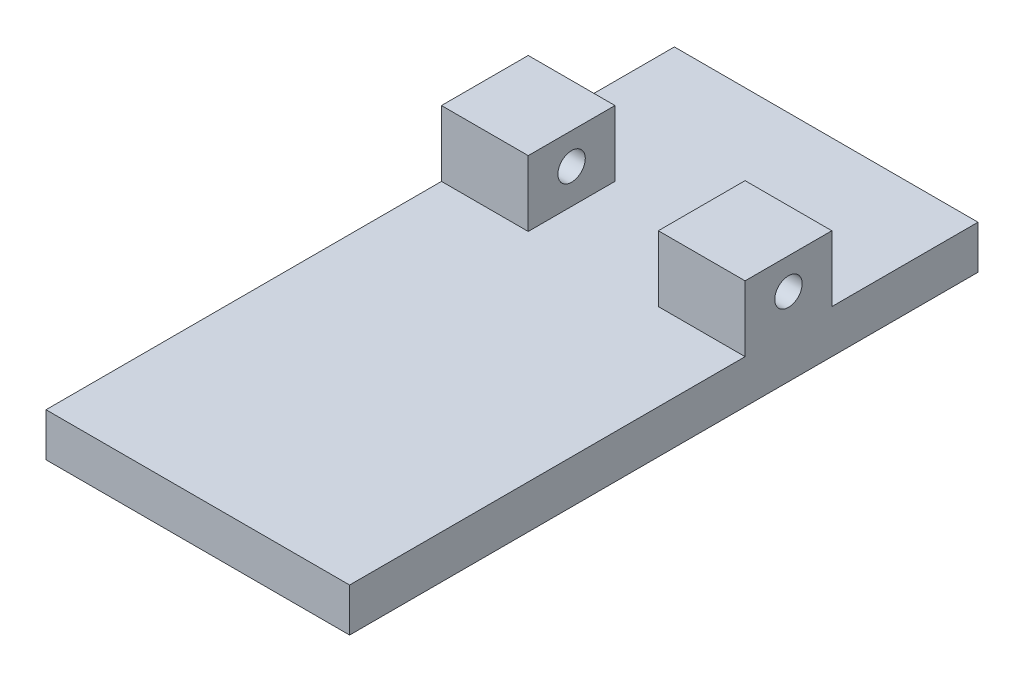
ISO-10303-21;
HEADER;
FILE_DESCRIPTION(('STEP AP214'),'2;1');
FILE_NAME('part.step','',(''),(''),'','','');
FILE_SCHEMA(('AUTOMOTIVE_DESIGN { 1 0 10303 214 1 1 1 1 }'));
ENDSEC;
DATA;
#1=APPLICATION_CONTEXT('core data for automotive mechanical design processes');
#2=APPLICATION_PROTOCOL_DEFINITION('international standard','automotive_design',2000,#1);
#3=PRODUCT_CONTEXT('',#1,'mechanical');
#4=PRODUCT('Part','Part','',(#3));
#5=PRODUCT_RELATED_PRODUCT_CATEGORY('part','',(#4));
#6=PRODUCT_DEFINITION_FORMATION('','',#4);
#7=PRODUCT_DEFINITION_CONTEXT('part definition',#1,'design');
#8=PRODUCT_DEFINITION('design','',#6,#7);
#9=PRODUCT_DEFINITION_SHAPE('','',#8);
#10=(LENGTH_UNIT() NAMED_UNIT(*) SI_UNIT(.MILLI.,.METRE.));
#11=(NAMED_UNIT(*) PLANE_ANGLE_UNIT() SI_UNIT($,.RADIAN.));
#12=(NAMED_UNIT(*) SI_UNIT($,.STERADIAN.) SOLID_ANGLE_UNIT());
#13=UNCERTAINTY_MEASURE_WITH_UNIT(LENGTH_MEASURE(1.E-05),#10,'distance_accuracy_value','');
#14=(GEOMETRIC_REPRESENTATION_CONTEXT(3) GLOBAL_UNCERTAINTY_ASSIGNED_CONTEXT((#13)) GLOBAL_UNIT_ASSIGNED_CONTEXT((#10,
#11,#12)) REPRESENTATION_CONTEXT('',''));
#15=CARTESIAN_POINT('',(0.,0.,0.));
#16=DIRECTION('',(0.,0.,1.));
#17=DIRECTION('',(1.,0.,0.));
#18=AXIS2_PLACEMENT_3D('',#15,#16,#17);
#19=CARTESIAN_POINT('',(-11.1125,3.175,20.6));
#20=DIRECTION('',(0.,0.,-1.));
#21=DIRECTION('',(-1.,0.,0.));
#22=AXIS2_PLACEMENT_3D('',#19,#20,#21);
#23=PLANE('',#22);
#24=DIRECTION('',(1.,0.,0.));
#25=VECTOR('',#24,1.);
#26=CARTESIAN_POINT('',(-11.1125,0.,20.6));
#27=LINE('',#26,#25);
#28=CARTESIAN_POINT('',(-11.1125,0.,20.6));
#29=VERTEX_POINT('',#28);
#30=CARTESIAN_POINT('',(11.1125,0.,20.6));
#31=VERTEX_POINT('',#30);
#32=EDGE_CURVE('E225',#29,#31,#27,.T.);
#33=ORIENTED_EDGE('',*,*,#32,.T.);
#34=DIRECTION('',(0.,-1.,0.));
#35=VECTOR('',#34,1.);
#36=CARTESIAN_POINT('',(11.1125,3.175,20.6));
#37=LINE('',#36,#35);
#38=CARTESIAN_POINT('',(11.1125,3.175,20.6));
#39=VERTEX_POINT('',#38);
#40=EDGE_CURVE('E11',#39,#31,#37,.T.);
#41=ORIENTED_EDGE('',*,*,#40,.F.);
#42=DIRECTION('',(1.,0.,0.));
#43=VECTOR('',#42,1.);
#44=CARTESIAN_POINT('',(-11.1125,3.175,20.6));
#45=LINE('',#44,#43);
#46=CARTESIAN_POINT('',(-11.1125,3.175,20.6));
#47=VERTEX_POINT('',#46);
#48=EDGE_CURVE('E226',#47,#39,#45,.T.);
#49=ORIENTED_EDGE('',*,*,#48,.F.);
#50=DIRECTION('',(0.,-1.,0.));
#51=VECTOR('',#50,1.);
#52=CARTESIAN_POINT('',(-11.1125,3.175,20.6));
#53=LINE('',#52,#51);
#54=EDGE_CURVE('E243',#47,#29,#53,.T.);
#55=ORIENTED_EDGE('',*,*,#54,.T.);
#56=EDGE_LOOP('',(#33,#41,#49,#55));
#57=FACE_BOUND('',#56,.T.);
#58=ADVANCED_FACE('F39',(#57),#23,.F.);
#59=CARTESIAN_POINT('',(11.1125,3.175,20.6));
#60=DIRECTION('',(-1.,0.,0.));
#61=DIRECTION('',(0.,0.,1.));
#62=AXIS2_PLACEMENT_3D('',#59,#60,#61);
#63=PLANE('',#62);
#64=CARTESIAN_POINT('',(11.1125,5.715,-11.525));
#65=DIRECTION('',(-1.,0.,0.));
#66=DIRECTION('',(0.,0.,1.));
#67=AXIS2_PLACEMENT_3D('',#64,#65,#66);
#68=CIRCLE('',#67,1.00249999999999);
#69=CARTESIAN_POINT('',(11.1125,5.715,-10.5225));
#70=VERTEX_POINT('',#69);
#71=EDGE_CURVE('E180',#70,#70,#68,.T.);
#72=ORIENTED_EDGE('',*,*,#71,.T.);
#73=EDGE_LOOP('',(#72));
#74=FACE_BOUND('',#73,.T.);
#75=DIRECTION('',(0.,0.,-1.));
#76=VECTOR('',#75,1.);
#77=CARTESIAN_POINT('',(11.1125,0.,20.6));
#78=LINE('',#77,#76);
#79=CARTESIAN_POINT('',(11.1125,0.,-25.4));
#80=VERTEX_POINT('',#79);
#81=EDGE_CURVE('E247',#31,#80,#78,.T.);
#82=ORIENTED_EDGE('',*,*,#81,.T.);
#83=DIRECTION('',(0.,-1.,0.));
#84=VECTOR('',#83,1.);
#85=CARTESIAN_POINT('',(11.1125,3.175,-25.4));
#86=LINE('',#85,#84);
#87=CARTESIAN_POINT('',(11.1125,3.175,-25.4));
#88=VERTEX_POINT('',#87);
#89=EDGE_CURVE('E47',#88,#80,#86,.T.);
#90=ORIENTED_EDGE('',*,*,#89,.F.);
#91=DIRECTION('',(0.,0.,-1.));
#92=VECTOR('',#91,1.);
#93=CARTESIAN_POINT('',(11.1125,3.175,20.6));
#94=LINE('',#93,#92);
#95=CARTESIAN_POINT('',(11.1125,3.175,-14.7));
#96=VERTEX_POINT('',#95);
#97=EDGE_CURVE('E230',#96,#88,#94,.T.);
#98=ORIENTED_EDGE('',*,*,#97,.F.);
#99=DIRECTION('',(0.,-1.,0.));
#100=VECTOR('',#99,1.);
#101=CARTESIAN_POINT('',(11.1125,7.98449,-14.7));
#102=LINE('',#101,#100);
#103=CARTESIAN_POINT('',(11.1125,7.98449,-14.7));
#104=VERTEX_POINT('',#103);
#105=EDGE_CURVE('E213',#104,#96,#102,.T.);
#106=ORIENTED_EDGE('',*,*,#105,.F.);
#107=DIRECTION('',(0.,0.,-1.));
#108=VECTOR('',#107,1.);
#109=CARTESIAN_POINT('',(11.1125,7.98449,-8.35));
#110=LINE('',#109,#108);
#111=CARTESIAN_POINT('',(11.1125,7.98449,-8.35));
#112=VERTEX_POINT('',#111);
#113=EDGE_CURVE('E193',#112,#104,#110,.T.);
#114=ORIENTED_EDGE('',*,*,#113,.F.);
#115=DIRECTION('',(0.,-1.,0.));
#116=VECTOR('',#115,1.);
#117=CARTESIAN_POINT('',(11.1125,7.98449,-8.35));
#118=LINE('',#117,#116);
#119=CARTESIAN_POINT('',(11.1125,3.175,-8.35));
#120=VERTEX_POINT('',#119);
#121=EDGE_CURVE('E217',#112,#120,#118,.T.);
#122=ORIENTED_EDGE('',*,*,#121,.T.);
#123=EDGE_CURVE('E232',#39,#120,#94,.T.);
#124=ORIENTED_EDGE('',*,*,#123,.F.);
#125=ORIENTED_EDGE('',*,*,#40,.T.);
#126=EDGE_LOOP('',(#82,#90,#98,#106,#114,#122,#124,#125));
#127=FACE_BOUND('',#126,.T.);
#128=ADVANCED_FACE('F270',(#74,#127),#63,.F.);
#129=CARTESIAN_POINT('',(-11.1125,3.175,-25.4));
#130=DIRECTION('',(0.,0.,-1.));
#131=DIRECTION('',(-1.,0.,0.));
#132=AXIS2_PLACEMENT_3D('',#129,#130,#131);
#133=PLANE('',#132);
#134=DIRECTION('',(1.,0.,0.));
#135=VECTOR('',#134,1.);
#136=CARTESIAN_POINT('',(-11.1125,0.,-25.4));
#137=LINE('',#136,#135);
#138=CARTESIAN_POINT('',(-11.1125,0.,-25.4));
#139=VERTEX_POINT('',#138);
#140=EDGE_CURVE('E251',#139,#80,#137,.T.);
#141=ORIENTED_EDGE('',*,*,#140,.F.);
#142=DIRECTION('',(0.,-1.,0.));
#143=VECTOR('',#142,1.);
#144=CARTESIAN_POINT('',(-11.1125,3.175,-25.4));
#145=LINE('',#144,#143);
#146=CARTESIAN_POINT('',(-11.1125,3.175,-25.4));
#147=VERTEX_POINT('',#146);
#148=EDGE_CURVE('E260',#147,#139,#145,.T.);
#149=ORIENTED_EDGE('',*,*,#148,.F.);
#150=DIRECTION('',(1.,0.,0.));
#151=VECTOR('',#150,1.);
#152=CARTESIAN_POINT('',(-11.1125,3.175,-25.4));
#153=LINE('',#152,#151);
#154=EDGE_CURVE('E235',#147,#88,#153,.T.);
#155=ORIENTED_EDGE('',*,*,#154,.T.);
#156=ORIENTED_EDGE('',*,*,#89,.T.);
#157=EDGE_LOOP('',(#141,#149,#155,#156));
#158=FACE_BOUND('',#157,.T.);
#159=ADVANCED_FACE('F266',(#158),#133,.T.);
#160=CARTESIAN_POINT('',(-11.1125,3.175,20.6));
#161=DIRECTION('',(-1.,0.,0.));
#162=DIRECTION('',(0.,0.,1.));
#163=AXIS2_PLACEMENT_3D('',#160,#161,#162);
#164=PLANE('',#163);
#165=CARTESIAN_POINT('',(-11.1125,5.715,-11.525));
#166=DIRECTION('',(1.,0.,0.));
#167=DIRECTION('',(0.,0.,-1.));
#168=AXIS2_PLACEMENT_3D('',#165,#166,#167);
#169=CIRCLE('',#168,1.00249999999999);
#170=CARTESIAN_POINT('',(-11.1125,5.715,-12.5275));
#171=VERTEX_POINT('',#170);
#172=EDGE_CURVE('E164',#171,#171,#169,.T.);
#173=ORIENTED_EDGE('',*,*,#172,.T.);
#174=EDGE_LOOP('',(#173));
#175=FACE_BOUND('',#174,.T.);
#176=DIRECTION('',(0.,0.,-1.));
#177=VECTOR('',#176,1.);
#178=CARTESIAN_POINT('',(-11.1125,0.,20.6));
#179=LINE('',#178,#177);
#180=EDGE_CURVE('E231',#29,#139,#179,.T.);
#181=ORIENTED_EDGE('',*,*,#180,.F.);
#182=ORIENTED_EDGE('',*,*,#54,.F.);
#183=DIRECTION('',(0.,0.,-1.));
#184=VECTOR('',#183,1.);
#185=CARTESIAN_POINT('',(-11.1125,3.175,20.6));
#186=LINE('',#185,#184);
#187=CARTESIAN_POINT('',(-11.1125,3.175,-8.35));
#188=VERTEX_POINT('',#187);
#189=EDGE_CURVE('E239',#47,#188,#186,.T.);
#190=ORIENTED_EDGE('',*,*,#189,.T.);
#191=DIRECTION('',(0.,-1.,0.));
#192=VECTOR('',#191,1.);
#193=CARTESIAN_POINT('',(-11.1125,7.98449,-8.35));
#194=LINE('',#193,#192);
#195=CARTESIAN_POINT('',(-11.1125,7.98449,-8.35));
#196=VERTEX_POINT('',#195);
#197=EDGE_CURVE('E171',#196,#188,#194,.T.);
#198=ORIENTED_EDGE('',*,*,#197,.F.);
#199=DIRECTION('',(0.,0.,-1.));
#200=VECTOR('',#199,1.);
#201=CARTESIAN_POINT('',(-11.1125,7.98449,-8.35));
#202=LINE('',#201,#200);
#203=CARTESIAN_POINT('',(-11.1125,7.98449,-14.7));
#204=VERTEX_POINT('',#203);
#205=EDGE_CURVE('E153',#196,#204,#202,.T.);
#206=ORIENTED_EDGE('',*,*,#205,.T.);
#207=DIRECTION('',(0.,-1.,0.));
#208=VECTOR('',#207,1.);
#209=CARTESIAN_POINT('',(-11.1125,7.98449,-14.7));
#210=LINE('',#209,#208);
#211=CARTESIAN_POINT('',(-11.1125,3.175,-14.7));
#212=VERTEX_POINT('',#211);
#213=EDGE_CURVE('E138',#204,#212,#210,.T.);
#214=ORIENTED_EDGE('',*,*,#213,.T.);
#215=EDGE_CURVE('E59',#212,#147,#186,.T.);
#216=ORIENTED_EDGE('',*,*,#215,.T.);
#217=ORIENTED_EDGE('',*,*,#148,.T.);
#218=EDGE_LOOP('',(#181,#182,#190,#198,#206,#214,#216,#217));
#219=FACE_BOUND('',#218,.T.);
#220=ADVANCED_FACE('F277',(#175,#219),#164,.T.);
#221=CARTESIAN_POINT('',(0.,3.175,0.));
#222=DIRECTION('',(0.,1.,0.));
#223=DIRECTION('',(0.,0.,1.));
#224=AXIS2_PLACEMENT_3D('',#221,#222,#223);
#225=PLANE('',#224);
#226=DIRECTION('',(1.,0.,0.));
#227=VECTOR('',#226,1.);
#228=CARTESIAN_POINT('',(-4.7625,3.175,-14.7));
#229=LINE('',#228,#227);
#230=CARTESIAN_POINT('',(-4.7625,3.175,-14.7));
#231=VERTEX_POINT('',#230);
#232=EDGE_CURVE('E54',#212,#231,#229,.T.);
#233=ORIENTED_EDGE('',*,*,#232,.T.);
#234=DIRECTION('',(0.,0.,1.));
#235=VECTOR('',#234,1.);
#236=CARTESIAN_POINT('',(-4.7625,3.175,-8.35));
#237=LINE('',#236,#235);
#238=CARTESIAN_POINT('',(-4.7625,3.175,-8.35));
#239=VERTEX_POINT('',#238);
#240=EDGE_CURVE('E133',#231,#239,#237,.T.);
#241=ORIENTED_EDGE('',*,*,#240,.T.);
#242=DIRECTION('',(-1.,0.,0.));
#243=VECTOR('',#242,1.);
#244=CARTESIAN_POINT('',(-4.7625,3.175,-8.35));
#245=LINE('',#244,#243);
#246=EDGE_CURVE('E149',#239,#188,#245,.T.);
#247=ORIENTED_EDGE('',*,*,#246,.T.);
#248=ORIENTED_EDGE('',*,*,#189,.F.);
#249=ORIENTED_EDGE('',*,*,#48,.T.);
#250=ORIENTED_EDGE('',*,*,#123,.T.);
#251=DIRECTION('',(1.,0.,0.));
#252=VECTOR('',#251,1.);
#253=CARTESIAN_POINT('',(4.7625,3.175,-8.35));
#254=LINE('',#253,#252);
#255=CARTESIAN_POINT('',(4.7625,3.175,-8.35));
#256=VERTEX_POINT('',#255);
#257=EDGE_CURVE('E203',#256,#120,#254,.T.);
#258=ORIENTED_EDGE('',*,*,#257,.F.);
#259=DIRECTION('',(0.,0.,1.));
#260=VECTOR('',#259,1.);
#261=CARTESIAN_POINT('',(4.7625,3.175,-8.35));
#262=LINE('',#261,#260);
#263=CARTESIAN_POINT('',(4.7625,3.175,-14.7));
#264=VERTEX_POINT('',#263);
#265=EDGE_CURVE('E184',#264,#256,#262,.T.);
#266=ORIENTED_EDGE('',*,*,#265,.F.);
#267=DIRECTION('',(-1.,0.,0.));
#268=VECTOR('',#267,1.);
#269=CARTESIAN_POINT('',(4.7625,3.175,-14.7));
#270=LINE('',#269,#268);
#271=EDGE_CURVE('E190',#96,#264,#270,.T.);
#272=ORIENTED_EDGE('',*,*,#271,.F.);
#273=ORIENTED_EDGE('',*,*,#97,.T.);
#274=ORIENTED_EDGE('',*,*,#154,.F.);
#275=ORIENTED_EDGE('',*,*,#215,.F.);
#276=EDGE_LOOP('',(#233,#241,#247,#248,#249,#250,#258,#266,#272,#273,#274,#275));
#277=FACE_BOUND('',#276,.T.);
#278=ADVANCED_FACE('F279',(#277),#225,.T.);
#279=CARTESIAN_POINT('',(0.,0.,0.));
#280=DIRECTION('',(0.,1.,0.));
#281=DIRECTION('',(0.,0.,1.));
#282=AXIS2_PLACEMENT_3D('',#279,#280,#281);
#283=PLANE('',#282);
#284=ORIENTED_EDGE('',*,*,#32,.F.);
#285=ORIENTED_EDGE('',*,*,#180,.T.);
#286=ORIENTED_EDGE('',*,*,#140,.T.);
#287=ORIENTED_EDGE('',*,*,#81,.F.);
#288=EDGE_LOOP('',(#284,#285,#286,#287));
#289=FACE_BOUND('',#288,.T.);
#290=ADVANCED_FACE('F274',(#289),#283,.F.);
#291=CARTESIAN_POINT('',(4.7625,7.98449,-8.35));
#292=DIRECTION('',(1.,0.,0.));
#293=DIRECTION('',(0.,0.,-1.));
#294=AXIS2_PLACEMENT_3D('',#291,#292,#293);
#295=PLANE('',#294);
#296=CARTESIAN_POINT('',(4.7625,5.715,-11.525));
#297=DIRECTION('',(-1.,0.,0.));
#298=DIRECTION('',(0.,0.,1.));
#299=AXIS2_PLACEMENT_3D('',#296,#297,#298);
#300=CIRCLE('',#299,1.00249999999999);
#301=CARTESIAN_POINT('',(4.7625,5.715,-10.5225));
#302=VERTEX_POINT('',#301);
#303=EDGE_CURVE('E137',#302,#302,#300,.T.);
#304=ORIENTED_EDGE('',*,*,#303,.F.);
#305=EDGE_LOOP('',(#304));
#306=FACE_BOUND('',#305,.T.);
#307=ORIENTED_EDGE('',*,*,#265,.T.);
#308=DIRECTION('',(0.,-1.,0.));
#309=VECTOR('',#308,1.);
#310=CARTESIAN_POINT('',(4.7625,7.98449,-8.35));
#311=LINE('',#310,#309);
#312=CARTESIAN_POINT('',(4.7625,7.98449,-8.35));
#313=VERTEX_POINT('',#312);
#314=EDGE_CURVE('E221',#313,#256,#311,.T.);
#315=ORIENTED_EDGE('',*,*,#314,.F.);
#316=DIRECTION('',(0.,0.,1.));
#317=VECTOR('',#316,1.);
#318=CARTESIAN_POINT('',(4.7625,7.98449,-8.35));
#319=LINE('',#318,#317);
#320=CARTESIAN_POINT('',(4.7625,7.98449,-14.7));
#321=VERTEX_POINT('',#320);
#322=EDGE_CURVE('E185',#321,#313,#319,.T.);
#323=ORIENTED_EDGE('',*,*,#322,.F.);
#324=DIRECTION('',(0.,-1.,0.));
#325=VECTOR('',#324,1.);
#326=CARTESIAN_POINT('',(4.7625,7.98449,-14.7));
#327=LINE('',#326,#325);
#328=EDGE_CURVE('E199',#321,#264,#327,.T.);
#329=ORIENTED_EDGE('',*,*,#328,.T.);
#330=EDGE_LOOP('',(#307,#315,#323,#329));
#331=FACE_BOUND('',#330,.T.);
#332=ADVANCED_FACE('F312',(#306,#331),#295,.F.);
#333=CARTESIAN_POINT('',(4.7625,7.98449,-8.35));
#334=DIRECTION('',(0.,0.,-1.));
#335=DIRECTION('',(-1.,0.,0.));
#336=AXIS2_PLACEMENT_3D('',#333,#334,#335);
#337=PLANE('',#336);
#338=ORIENTED_EDGE('',*,*,#257,.T.);
#339=ORIENTED_EDGE('',*,*,#121,.F.);
#340=DIRECTION('',(1.,0.,0.));
#341=VECTOR('',#340,1.);
#342=CARTESIAN_POINT('',(4.7625,7.98449,-8.35));
#343=LINE('',#342,#341);
#344=EDGE_CURVE('E189',#313,#112,#343,.T.);
#345=ORIENTED_EDGE('',*,*,#344,.F.);
#346=ORIENTED_EDGE('',*,*,#314,.T.);
#347=EDGE_LOOP('',(#338,#339,#345,#346));
#348=FACE_BOUND('',#347,.T.);
#349=ADVANCED_FACE('F294',(#348),#337,.F.);
#350=CARTESIAN_POINT('',(4.7625,7.98449,-14.7));
#351=DIRECTION('',(0.,0.,1.));
#352=DIRECTION('',(1.,0.,0.));
#353=AXIS2_PLACEMENT_3D('',#350,#351,#352);
#354=PLANE('',#353);
#355=ORIENTED_EDGE('',*,*,#271,.T.);
#356=ORIENTED_EDGE('',*,*,#328,.F.);
#357=DIRECTION('',(-1.,0.,0.));
#358=VECTOR('',#357,1.);
#359=CARTESIAN_POINT('',(4.7625,7.98449,-14.7));
#360=LINE('',#359,#358);
#361=EDGE_CURVE('E196',#104,#321,#360,.T.);
#362=ORIENTED_EDGE('',*,*,#361,.F.);
#363=ORIENTED_EDGE('',*,*,#105,.T.);
#364=EDGE_LOOP('',(#355,#356,#362,#363));
#365=FACE_BOUND('',#364,.T.);
#366=ADVANCED_FACE('F286',(#365),#354,.F.);
#367=CARTESIAN_POINT('',(0.,7.98449,0.));
#368=DIRECTION('',(0.,-1.,0.));
#369=DIRECTION('',(0.,0.,-1.));
#370=AXIS2_PLACEMENT_3D('',#367,#368,#369);
#371=PLANE('',#370);
#372=ORIENTED_EDGE('',*,*,#322,.T.);
#373=ORIENTED_EDGE('',*,*,#344,.T.);
#374=ORIENTED_EDGE('',*,*,#113,.T.);
#375=ORIENTED_EDGE('',*,*,#361,.T.);
#376=EDGE_LOOP('',(#372,#373,#374,#375));
#377=FACE_BOUND('',#376,.T.);
#378=ADVANCED_FACE('F290',(#377),#371,.F.);
#379=CARTESIAN_POINT('',(4.7625,5.715,-11.525));
#380=DIRECTION('',(-1.,0.,0.));
#381=DIRECTION('',(0.,0.,1.));
#382=AXIS2_PLACEMENT_3D('',#379,#380,#381);
#383=CYLINDRICAL_SURFACE('',#382,1.00249999999999);
#384=ORIENTED_EDGE('',*,*,#71,.F.);
#385=EDGE_LOOP('',(#384));
#386=FACE_BOUND('',#385,.T.);
#387=ORIENTED_EDGE('',*,*,#303,.T.);
#388=EDGE_LOOP('',(#387));
#389=FACE_BOUND('',#388,.T.);
#390=ADVANCED_FACE('F324',(#386,#389),#383,.F.);
#391=CARTESIAN_POINT('',(-4.7625,7.98449,-8.35));
#392=DIRECTION('',(1.,0.,0.));
#393=DIRECTION('',(0.,0.,-1.));
#394=AXIS2_PLACEMENT_3D('',#391,#392,#393);
#395=PLANE('',#394);
#396=CARTESIAN_POINT('',(-4.7625,5.715,-11.525));
#397=DIRECTION('',(1.,0.,0.));
#398=DIRECTION('',(0.,0.,-1.));
#399=AXIS2_PLACEMENT_3D('',#396,#397,#398);
#400=CIRCLE('',#399,1.00249999999999);
#401=CARTESIAN_POINT('',(-4.7625,5.715,-12.5275));
#402=VERTEX_POINT('',#401);
#403=EDGE_CURVE('E349',#402,#402,#400,.T.);
#404=ORIENTED_EDGE('',*,*,#403,.F.);
#405=EDGE_LOOP('',(#404));
#406=FACE_BOUND('',#405,.T.);
#407=ORIENTED_EDGE('',*,*,#240,.F.);
#408=DIRECTION('',(0.,-1.,0.));
#409=VECTOR('',#408,1.);
#410=CARTESIAN_POINT('',(-4.7625,7.98449,-14.7));
#411=LINE('',#410,#409);
#412=CARTESIAN_POINT('',(-4.7625,7.98449,-14.7));
#413=VERTEX_POINT('',#412);
#414=EDGE_CURVE('E127',#413,#231,#411,.T.);
#415=ORIENTED_EDGE('',*,*,#414,.F.);
#416=DIRECTION('',(0.,0.,1.));
#417=VECTOR('',#416,1.);
#418=CARTESIAN_POINT('',(-4.7625,7.98449,-8.35));
#419=LINE('',#418,#417);
#420=CARTESIAN_POINT('',(-4.7625,7.98449,-8.35));
#421=VERTEX_POINT('',#420);
#422=EDGE_CURVE('E131',#413,#421,#419,.T.);
#423=ORIENTED_EDGE('',*,*,#422,.T.);
#424=DIRECTION('',(0.,-1.,0.));
#425=VECTOR('',#424,1.);
#426=CARTESIAN_POINT('',(-4.7625,7.98449,-8.35));
#427=LINE('',#426,#425);
#428=EDGE_CURVE('E161',#421,#239,#427,.T.);
#429=ORIENTED_EDGE('',*,*,#428,.T.);
#430=EDGE_LOOP('',(#407,#415,#423,#429));
#431=FACE_BOUND('',#430,.T.);
#432=ADVANCED_FACE('F129',(#406,#431),#395,.T.);
#433=CARTESIAN_POINT('',(-4.7625,7.98449,-14.7));
#434=DIRECTION('',(0.,0.,-1.));
#435=DIRECTION('',(-1.,0.,0.));
#436=AXIS2_PLACEMENT_3D('',#433,#434,#435);
#437=PLANE('',#436);
#438=ORIENTED_EDGE('',*,*,#232,.F.);
#439=ORIENTED_EDGE('',*,*,#213,.F.);
#440=DIRECTION('',(1.,0.,0.));
#441=VECTOR('',#440,1.);
#442=CARTESIAN_POINT('',(-4.7625,7.98449,-14.7));
#443=LINE('',#442,#441);
#444=EDGE_CURVE('E144',#204,#413,#443,.T.);
#445=ORIENTED_EDGE('',*,*,#444,.T.);
#446=ORIENTED_EDGE('',*,*,#414,.T.);
#447=EDGE_LOOP('',(#438,#439,#445,#446));
#448=FACE_BOUND('',#447,.T.);
#449=ADVANCED_FACE('F151',(#448),#437,.T.);
#450=CARTESIAN_POINT('',(-4.7625,7.98449,-8.35));
#451=DIRECTION('',(0.,0.,1.));
#452=DIRECTION('',(1.,0.,0.));
#453=AXIS2_PLACEMENT_3D('',#450,#451,#452);
#454=PLANE('',#453);
#455=ORIENTED_EDGE('',*,*,#246,.F.);
#456=ORIENTED_EDGE('',*,*,#428,.F.);
#457=DIRECTION('',(-1.,0.,0.));
#458=VECTOR('',#457,1.);
#459=CARTESIAN_POINT('',(-4.7625,7.98449,-8.35));
#460=LINE('',#459,#458);
#461=EDGE_CURVE('E147',#421,#196,#460,.T.);
#462=ORIENTED_EDGE('',*,*,#461,.T.);
#463=ORIENTED_EDGE('',*,*,#197,.T.);
#464=EDGE_LOOP('',(#455,#456,#462,#463));
#465=FACE_BOUND('',#464,.T.);
#466=ADVANCED_FACE('F333',(#465),#454,.T.);
#467=CARTESIAN_POINT('',(0.,7.98449,0.));
#468=DIRECTION('',(0.,-1.,0.));
#469=DIRECTION('',(0.,0.,-1.));
#470=AXIS2_PLACEMENT_3D('',#467,#468,#469);
#471=PLANE('',#470);
#472=ORIENTED_EDGE('',*,*,#422,.F.);
#473=ORIENTED_EDGE('',*,*,#444,.F.);
#474=ORIENTED_EDGE('',*,*,#205,.F.);
#475=ORIENTED_EDGE('',*,*,#461,.F.);
#476=EDGE_LOOP('',(#472,#473,#474,#475));
#477=FACE_BOUND('',#476,.T.);
#478=ADVANCED_FACE('F142',(#477),#471,.F.);
#479=CARTESIAN_POINT('',(-4.7625,5.715,-11.525));
#480=DIRECTION('',(1.,0.,0.));
#481=DIRECTION('',(0.,0.,-1.));
#482=AXIS2_PLACEMENT_3D('',#479,#480,#481);
#483=CYLINDRICAL_SURFACE('',#482,1.00249999999999);
#484=ORIENTED_EDGE('',*,*,#172,.F.);
#485=EDGE_LOOP('',(#484));
#486=FACE_BOUND('',#485,.T.);
#487=ORIENTED_EDGE('',*,*,#403,.T.);
#488=EDGE_LOOP('',(#487));
#489=FACE_BOUND('',#488,.T.);
#490=ADVANCED_FACE('F339',(#486,#489),#483,.F.);
#491=CLOSED_SHELL('',(#58,#128,#159,#220,#278,#290,#332,#349,#366,#378,#390,#432,#449,#466,#478,#490));
#492=MANIFOLD_SOLID_BREP('B2',#491);
#493=ADVANCED_BREP_SHAPE_REPRESENTATION('',(#18,#492),#14);
#494=SHAPE_DEFINITION_REPRESENTATION(#9,#493);
ENDSEC;
END-ISO-10303-21;
